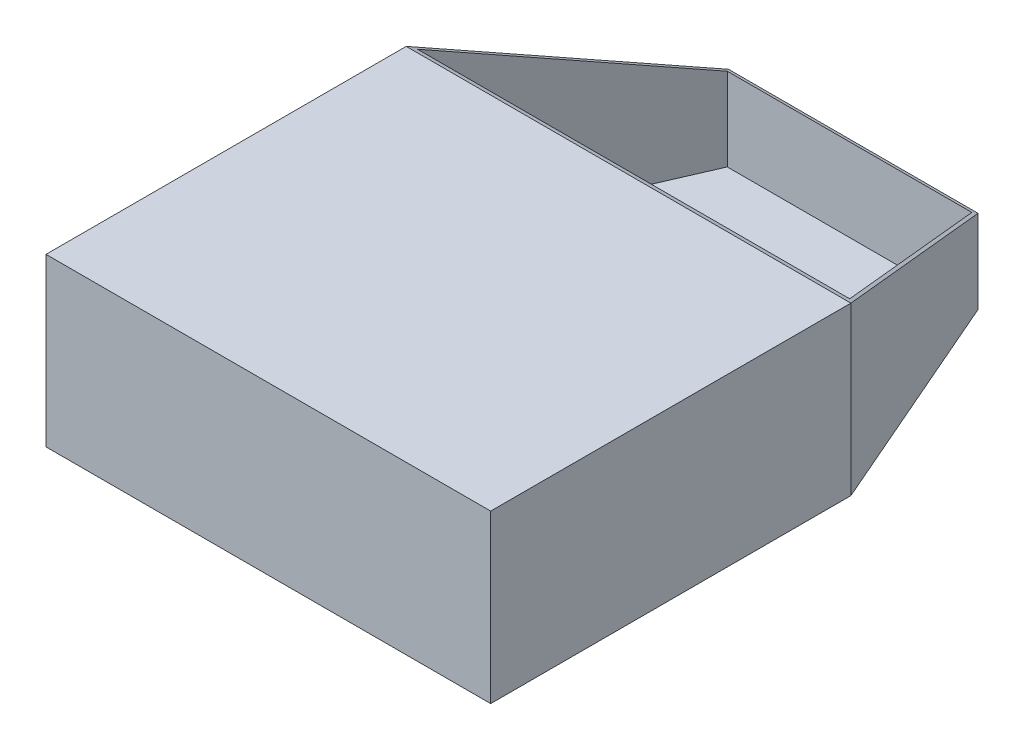
ISO-10303-21;
HEADER;
FILE_DESCRIPTION(('STEP AP214'),'2;1');
FILE_NAME('part.step','',(''),(''),'','','');
FILE_SCHEMA(('AUTOMOTIVE_DESIGN { 1 0 10303 214 1 1 1 1 }'));
ENDSEC;
DATA;
#1=APPLICATION_CONTEXT('core data for automotive mechanical design processes');
#2=APPLICATION_PROTOCOL_DEFINITION('international standard','automotive_design',2000,#1);
#3=PRODUCT_CONTEXT('',#1,'mechanical');
#4=PRODUCT('Part','Part','',(#3));
#5=PRODUCT_RELATED_PRODUCT_CATEGORY('part','',(#4));
#6=PRODUCT_DEFINITION_FORMATION('','',#4);
#7=PRODUCT_DEFINITION_CONTEXT('part definition',#1,'design');
#8=PRODUCT_DEFINITION('design','',#6,#7);
#9=PRODUCT_DEFINITION_SHAPE('','',#8);
#10=(LENGTH_UNIT() NAMED_UNIT(*) SI_UNIT(.MILLI.,.METRE.));
#11=(NAMED_UNIT(*) PLANE_ANGLE_UNIT() SI_UNIT($,.RADIAN.));
#12=(NAMED_UNIT(*) SI_UNIT($,.STERADIAN.) SOLID_ANGLE_UNIT());
#13=UNCERTAINTY_MEASURE_WITH_UNIT(LENGTH_MEASURE(1.E-05),#10,'distance_accuracy_value','');
#14=(GEOMETRIC_REPRESENTATION_CONTEXT(3) GLOBAL_UNCERTAINTY_ASSIGNED_CONTEXT((#13)) GLOBAL_UNIT_ASSIGNED_CONTEXT((#10,
#11,#12)) REPRESENTATION_CONTEXT('',''));
#15=CARTESIAN_POINT('',(0.,0.,0.));
#16=DIRECTION('',(0.,0.,1.));
#17=DIRECTION('',(1.,0.,0.));
#18=AXIS2_PLACEMENT_3D('',#15,#16,#17);
#19=CARTESIAN_POINT('',(0.,89.,0.));
#20=DIRECTION('',(1.,0.,0.));
#21=DIRECTION('',(0.,0.,-1.));
#22=AXIS2_PLACEMENT_3D('',#19,#20,#21);
#23=PLANE('',#22);
#24=DIRECTION('',(0.,0.,1.));
#25=VECTOR('',#24,1.);
#26=CARTESIAN_POINT('',(0.,1.,0.));
#27=LINE('',#26,#25);
#28=CARTESIAN_POINT('',(0.,1.,-192.));
#29=VERTEX_POINT('',#28);
#30=CARTESIAN_POINT('',(0.,1.,0.));
#31=VERTEX_POINT('',#30);
#32=EDGE_CURVE('E257',#29,#31,#27,.T.);
#33=ORIENTED_EDGE('',*,*,#32,.F.);
#34=DIRECTION('',(0.,-1.,0.));
#35=VECTOR('',#34,1.);
#36=CARTESIAN_POINT('',(0.,89.,-192.));
#37=LINE('',#36,#35);
#38=CARTESIAN_POINT('',(0.,89.,-192.));
#39=VERTEX_POINT('',#38);
#40=EDGE_CURVE('E234',#39,#29,#37,.T.);
#41=ORIENTED_EDGE('',*,*,#40,.F.);
#42=DIRECTION('',(0.,0.,1.));
#43=VECTOR('',#42,1.);
#44=CARTESIAN_POINT('',(0.,89.,0.));
#45=LINE('',#44,#43);
#46=CARTESIAN_POINT('',(0.,89.,0.));
#47=VERTEX_POINT('',#46);
#48=EDGE_CURVE('E242',#39,#47,#45,.T.);
#49=ORIENTED_EDGE('',*,*,#48,.T.);
#50=DIRECTION('',(0.,-1.,0.));
#51=VECTOR('',#50,1.);
#52=CARTESIAN_POINT('',(0.,89.,0.));
#53=LINE('',#52,#51);
#54=EDGE_CURVE('E190',#47,#31,#53,.T.);
#55=ORIENTED_EDGE('',*,*,#54,.T.);
#56=EDGE_LOOP('',(#33,#41,#49,#55));
#57=FACE_BOUND('',#56,.T.);
#58=ADVANCED_FACE('F39',(#57),#23,.T.);
#59=CARTESIAN_POINT('',(0.,89.,0.));
#60=DIRECTION('',(0.,0.,-1.));
#61=DIRECTION('',(-1.,0.,0.));
#62=AXIS2_PLACEMENT_3D('',#59,#60,#61);
#63=PLANE('',#62);
#64=DIRECTION('',(1.,0.,0.));
#65=VECTOR('',#64,1.);
#66=CARTESIAN_POINT('',(0.,1.,0.));
#67=LINE('',#66,#65);
#68=CARTESIAN_POINT('',(236.,1.,0.));
#69=VERTEX_POINT('',#68);
#70=EDGE_CURVE('E254',#31,#69,#67,.T.);
#71=ORIENTED_EDGE('',*,*,#70,.F.);
#72=ORIENTED_EDGE('',*,*,#54,.F.);
#73=DIRECTION('',(1.,0.,0.));
#74=VECTOR('',#73,1.);
#75=CARTESIAN_POINT('',(0.,89.,0.));
#76=LINE('',#75,#74);
#77=CARTESIAN_POINT('',(236.,89.,0.));
#78=VERTEX_POINT('',#77);
#79=EDGE_CURVE('E270',#47,#78,#76,.T.);
#80=ORIENTED_EDGE('',*,*,#79,.T.);
#81=DIRECTION('',(0.,-1.,0.));
#82=VECTOR('',#81,1.);
#83=CARTESIAN_POINT('',(236.,89.,0.));
#84=LINE('',#83,#82);
#85=EDGE_CURVE('E197',#78,#69,#84,.T.);
#86=ORIENTED_EDGE('',*,*,#85,.T.);
#87=EDGE_LOOP('',(#71,#72,#80,#86));
#88=FACE_BOUND('',#87,.T.);
#89=ADVANCED_FACE('F315',(#88),#63,.T.);
#90=CARTESIAN_POINT('',(236.,89.,0.));
#91=DIRECTION('',(-1.,0.,0.));
#92=DIRECTION('',(0.,0.,1.));
#93=AXIS2_PLACEMENT_3D('',#90,#91,#92);
#94=PLANE('',#93);
#95=DIRECTION('',(0.,0.,-1.));
#96=VECTOR('',#95,1.);
#97=CARTESIAN_POINT('',(236.,1.,0.));
#98=LINE('',#97,#96);
#99=CARTESIAN_POINT('',(236.,1.,-192.));
#100=VERTEX_POINT('',#99);
#101=EDGE_CURVE('E251',#69,#100,#98,.T.);
#102=ORIENTED_EDGE('',*,*,#101,.F.);
#103=ORIENTED_EDGE('',*,*,#85,.F.);
#104=DIRECTION('',(0.,0.,-1.));
#105=VECTOR('',#104,1.);
#106=CARTESIAN_POINT('',(236.,89.,0.));
#107=LINE('',#106,#105);
#108=CARTESIAN_POINT('',(236.,89.,-192.));
#109=VERTEX_POINT('',#108);
#110=EDGE_CURVE('E267',#78,#109,#107,.T.);
#111=ORIENTED_EDGE('',*,*,#110,.T.);
#112=DIRECTION('',(0.,-1.,0.));
#113=VECTOR('',#112,1.);
#114=CARTESIAN_POINT('',(236.,89.,-192.));
#115=LINE('',#114,#113);
#116=EDGE_CURVE('E224',#109,#100,#115,.T.);
#117=ORIENTED_EDGE('',*,*,#116,.T.);
#118=EDGE_LOOP('',(#102,#103,#111,#117));
#119=FACE_BOUND('',#118,.T.);
#120=ADVANCED_FACE('F318',(#119),#94,.T.);
#121=CARTESIAN_POINT('',(184.,89.,-311.700426223177));
#122=DIRECTION('',(-0.917192351040594,0.,0.398444715352868));
#123=DIRECTION('',(0.398444715352868,0.,0.917192351040594));
#124=AXIS2_PLACEMENT_3D('',#121,#122,#123);
#125=PLANE('',#124);
#126=DIRECTION('',(0.377201670473407,0.322160431912779,0.868292321687715));
#127=VECTOR('',#126,1.);
#128=CARTESIAN_POINT('',(189.256681788977,50.2316824253489,-299.599906018173));
#129=LINE('',#128,#127);
#130=CARTESIAN_POINT('',(184.,45.7420552361596,-311.700426223177));
#131=VERTEX_POINT('',#130);
#132=CARTESIAN_POINT('',(234.648581917051,89.,-195.110871548744));
#133=VERTEX_POINT('',#132);
#134=EDGE_CURVE('E55',#131,#133,#129,.T.);
#135=ORIENTED_EDGE('',*,*,#134,.F.);
#136=DIRECTION('',(0.,-1.,0.));
#137=VECTOR('',#136,1.);
#138=CARTESIAN_POINT('',(184.,89.,-311.700426223177));
#139=LINE('',#138,#137);
#140=CARTESIAN_POINT('',(184.,1.,-311.700426223177));
#141=VERTEX_POINT('',#140);
#142=EDGE_CURVE('E228',#131,#141,#139,.T.);
#143=ORIENTED_EDGE('',*,*,#142,.T.);
#144=DIRECTION('',(-0.398444715352868,0.,-0.917192351040594));
#145=VECTOR('',#144,1.);
#146=CARTESIAN_POINT('',(184.,1.,-311.700426223177));
#147=LINE('',#146,#145);
#148=EDGE_CURVE('E247',#100,#141,#147,.T.);
#149=ORIENTED_EDGE('',*,*,#148,.F.);
#150=ORIENTED_EDGE('',*,*,#116,.F.);
#151=DIRECTION('',(-0.398444715352868,0.,-0.917192351040594));
#152=VECTOR('',#151,1.);
#153=CARTESIAN_POINT('',(184.,89.,-311.700426223177));
#154=LINE('',#153,#152);
#155=EDGE_CURVE('E263',#109,#133,#154,.T.);
#156=ORIENTED_EDGE('',*,*,#155,.T.);
#157=EDGE_LOOP('',(#135,#143,#149,#150,#156));
#158=FACE_BOUND('',#157,.T.);
#159=ADVANCED_FACE('F306',(#158),#125,.T.);
#160=CARTESIAN_POINT('',(52.,89.,-311.700426223177));
#161=DIRECTION('',(0.,0.,1.));
#162=DIRECTION('',(1.,0.,0.));
#163=AXIS2_PLACEMENT_3D('',#160,#161,#162);
#164=PLANE('',#163);
#165=DIRECTION('',(1.,0.,0.));
#166=VECTOR('',#165,1.);
#167=CARTESIAN_POINT('',(52.,45.7420552361596,-311.700426223177));
#168=LINE('',#167,#166);
#169=CARTESIAN_POINT('',(52.,45.7420552361596,-311.700426223177));
#170=VERTEX_POINT('',#169);
#171=EDGE_CURVE('E280',#170,#131,#168,.T.);
#172=ORIENTED_EDGE('',*,*,#171,.F.);
#173=DIRECTION('',(0.,-1.,0.));
#174=VECTOR('',#173,1.);
#175=CARTESIAN_POINT('',(52.,89.,-311.700426223177));
#176=LINE('',#175,#174);
#177=CARTESIAN_POINT('',(52.,1.,-311.700426223177));
#178=VERTEX_POINT('',#177);
#179=EDGE_CURVE('E231',#170,#178,#176,.T.);
#180=ORIENTED_EDGE('',*,*,#179,.T.);
#181=DIRECTION('',(-1.,0.,0.));
#182=VECTOR('',#181,1.);
#183=CARTESIAN_POINT('',(52.,1.,-311.700426223177));
#184=LINE('',#183,#182);
#185=EDGE_CURVE('E243',#141,#178,#184,.T.);
#186=ORIENTED_EDGE('',*,*,#185,.F.);
#187=ORIENTED_EDGE('',*,*,#142,.F.);
#188=EDGE_LOOP('',(#172,#180,#186,#187));
#189=FACE_BOUND('',#188,.T.);
#190=ADVANCED_FACE('F294',(#189),#164,.T.);
#191=CARTESIAN_POINT('',(0.,89.,-192.));
#192=DIRECTION('',(0.917192351040594,0.,0.398444715352869));
#193=DIRECTION('',(0.398444715352869,0.,-0.917192351040594));
#194=AXIS2_PLACEMENT_3D('',#191,#192,#193);
#195=PLANE('',#194);
#196=DIRECTION('',(0.377201670473407,-0.322160431912779,-0.868292321687715));
#197=VECTOR('',#196,1.);
#198=CARTESIAN_POINT('',(0.140260093314504,90.0344259095289,-192.322869095228));
#199=LINE('',#198,#197);
#200=CARTESIAN_POINT('',(1.35141808294902,89.,-195.110871548744));
#201=VERTEX_POINT('',#200);
#202=EDGE_CURVE('E283',#201,#170,#199,.T.);
#203=ORIENTED_EDGE('',*,*,#202,.F.);
#204=DIRECTION('',(-0.398444715352869,0.,0.917192351040594));
#205=VECTOR('',#204,1.);
#206=CARTESIAN_POINT('',(0.,89.,-192.));
#207=LINE('',#206,#205);
#208=EDGE_CURVE('E238',#201,#39,#207,.T.);
#209=ORIENTED_EDGE('',*,*,#208,.T.);
#210=ORIENTED_EDGE('',*,*,#40,.T.);
#211=DIRECTION('',(-0.398444715352869,0.,0.917192351040594));
#212=VECTOR('',#211,1.);
#213=CARTESIAN_POINT('',(0.,1.,-192.));
#214=LINE('',#213,#212);
#215=EDGE_CURVE('E239',#178,#29,#214,.T.);
#216=ORIENTED_EDGE('',*,*,#215,.F.);
#217=ORIENTED_EDGE('',*,*,#179,.F.);
#218=EDGE_LOOP('',(#203,#209,#210,#216,#217));
#219=FACE_BOUND('',#218,.T.);
#220=ADVANCED_FACE('F297',(#219),#195,.T.);
#221=CARTESIAN_POINT('',(0.,89.,0.));
#222=DIRECTION('',(0.,1.,0.));
#223=DIRECTION('',(0.,0.,1.));
#224=AXIS2_PLACEMENT_3D('',#221,#222,#223);
#225=PLANE('',#224);
#226=ORIENTED_EDGE('',*,*,#208,.F.);
#227=DIRECTION('',(1.,0.,0.));
#228=VECTOR('',#227,1.);
#229=CARTESIAN_POINT('',(0.,89.,-195.110871548744));
#230=LINE('',#229,#228);
#231=EDGE_CURVE('E11',#201,#133,#230,.T.);
#232=ORIENTED_EDGE('',*,*,#231,.T.);
#233=ORIENTED_EDGE('',*,*,#155,.F.);
#234=ORIENTED_EDGE('',*,*,#110,.F.);
#235=ORIENTED_EDGE('',*,*,#79,.F.);
#236=ORIENTED_EDGE('',*,*,#48,.F.);
#237=EDGE_LOOP('',(#226,#232,#233,#234,#235,#236));
#238=FACE_BOUND('',#237,.T.);
#239=ADVANCED_FACE('F310',(#238),#225,.F.);
#240=CARTESIAN_POINT('',(0.,1.,0.));
#241=DIRECTION('',(0.,1.,0.));
#242=DIRECTION('',(0.,0.,1.));
#243=AXIS2_PLACEMENT_3D('',#240,#241,#242);
#244=PLANE('',#243);
#245=ORIENTED_EDGE('',*,*,#32,.T.);
#246=ORIENTED_EDGE('',*,*,#70,.T.);
#247=ORIENTED_EDGE('',*,*,#101,.T.);
#248=ORIENTED_EDGE('',*,*,#148,.T.);
#249=ORIENTED_EDGE('',*,*,#185,.T.);
#250=ORIENTED_EDGE('',*,*,#215,.T.);
#251=EDGE_LOOP('',(#245,#246,#247,#248,#249,#250));
#252=FACE_BOUND('',#251,.T.);
#253=ADVANCED_FACE('F301',(#252),#244,.T.);
#254=CARTESIAN_POINT('',(-1.99999999999989,90.,-192.415654397053));
#255=DIRECTION('',(0.,-0.937547911369,0.347856168390939));
#256=DIRECTION('',(0.,-0.347856168390939,-0.937547911369));
#257=AXIS2_PLACEMENT_3D('',#254,#255,#256);
#258=PLANE('',#257);
#259=ORIENTED_EDGE('',*,*,#134,.T.);
#260=ORIENTED_EDGE('',*,*,#231,.F.);
#261=ORIENTED_EDGE('',*,*,#202,.T.);
#262=ORIENTED_EDGE('',*,*,#171,.T.);
#263=EDGE_LOOP('',(#259,#260,#261,#262));
#264=FACE_BOUND('',#263,.T.);
#265=DIRECTION('',(1.,0.,0.));
#266=VECTOR('',#265,1.);
#267=CARTESIAN_POINT('',(-1.99999999999989,90.,-192.415654397053));
#268=LINE('',#267,#266);
#269=CARTESIAN_POINT('',(-2.,90.,-192.415654397053));
#270=VERTEX_POINT('',#269);
#271=CARTESIAN_POINT('',(238.,90.,-192.415654397053));
#272=VERTEX_POINT('',#271);
#273=EDGE_CURVE('E146',#270,#272,#268,.T.);
#274=ORIENTED_EDGE('',*,*,#273,.T.);
#275=DIRECTION('',(-0.377201670473407,-0.322160431912779,-0.868292321687715));
#276=VECTOR('',#275,1.);
#277=CARTESIAN_POINT('',(238.,90.,-192.415654397053));
#278=LINE('',#277,#276);
#279=CARTESIAN_POINT('',(185.311732013388,45.,-313.700426223177));
#280=VERTEX_POINT('',#279);
#281=EDGE_CURVE('E142',#272,#280,#278,.T.);
#282=ORIENTED_EDGE('',*,*,#281,.T.);
#283=DIRECTION('',(1.,0.,0.));
#284=VECTOR('',#283,1.);
#285=CARTESIAN_POINT('',(-54.6882679866122,45.,-313.700426223177));
#286=LINE('',#285,#284);
#287=CARTESIAN_POINT('',(50.6882679866123,45.,-313.700426223177));
#288=VERTEX_POINT('',#287);
#289=EDGE_CURVE('E145',#288,#280,#286,.T.);
#290=ORIENTED_EDGE('',*,*,#289,.F.);
#291=DIRECTION('',(0.377201670473407,-0.322160431912779,-0.868292321687715));
#292=VECTOR('',#291,1.);
#293=CARTESIAN_POINT('',(-64.7356658003288,143.581282302393,-48.0024633260111));
#294=LINE('',#293,#292);
#295=EDGE_CURVE('E63',#270,#288,#294,.T.);
#296=ORIENTED_EDGE('',*,*,#295,.F.);
#297=EDGE_LOOP('',(#274,#282,#290,#296));
#298=FACE_BOUND('',#297,.T.);
#299=ADVANCED_FACE('F144',(#264,#298),#258,.F.);
#300=CARTESIAN_POINT('',(-2.,90.,0.));
#301=DIRECTION('',(1.,0.,0.));
#302=DIRECTION('',(0.,0.,-1.));
#303=AXIS2_PLACEMENT_3D('',#300,#301,#302);
#304=PLANE('',#303);
#305=DIRECTION('',(0.,0.,1.));
#306=VECTOR('',#305,1.);
#307=CARTESIAN_POINT('',(-2.,0.,0.));
#308=LINE('',#307,#306);
#309=CARTESIAN_POINT('',(-2.,0.,-192.415654397053));
#310=VERTEX_POINT('',#309);
#311=CARTESIAN_POINT('',(-2.,0.,2.));
#312=VERTEX_POINT('',#311);
#313=EDGE_CURVE('E187',#310,#312,#308,.T.);
#314=ORIENTED_EDGE('',*,*,#313,.T.);
#315=DIRECTION('',(0.,-1.,0.));
#316=VECTOR('',#315,1.);
#317=CARTESIAN_POINT('',(-2.,90.,2.));
#318=LINE('',#317,#316);
#319=CARTESIAN_POINT('',(-2.,90.,2.));
#320=VERTEX_POINT('',#319);
#321=EDGE_CURVE('E48',#320,#312,#318,.T.);
#322=ORIENTED_EDGE('',*,*,#321,.F.);
#323=DIRECTION('',(0.,0.,1.));
#324=VECTOR('',#323,1.);
#325=CARTESIAN_POINT('',(-2.,90.,0.));
#326=LINE('',#325,#324);
#327=EDGE_CURVE('E211',#270,#320,#326,.T.);
#328=ORIENTED_EDGE('',*,*,#327,.F.);
#329=DIRECTION('',(0.,-1.,0.));
#330=VECTOR('',#329,1.);
#331=CARTESIAN_POINT('',(-2.,90.,-192.415654397053));
#332=LINE('',#331,#330);
#333=EDGE_CURVE('E173',#270,#310,#332,.T.);
#334=ORIENTED_EDGE('',*,*,#333,.T.);
#335=EDGE_LOOP('',(#314,#322,#328,#334));
#336=FACE_BOUND('',#335,.T.);
#337=ADVANCED_FACE('F41',(#336),#304,.F.);
#338=CARTESIAN_POINT('',(0.,90.,2.));
#339=DIRECTION('',(0.,0.,-1.));
#340=DIRECTION('',(-1.,0.,0.));
#341=AXIS2_PLACEMENT_3D('',#338,#339,#340);
#342=PLANE('',#341);
#343=DIRECTION('',(1.,0.,0.));
#344=VECTOR('',#343,1.);
#345=CARTESIAN_POINT('',(0.,0.,2.));
#346=LINE('',#345,#344);
#347=CARTESIAN_POINT('',(238.,0.,2.));
#348=VERTEX_POINT('',#347);
#349=EDGE_CURVE('E183',#312,#348,#346,.T.);
#350=ORIENTED_EDGE('',*,*,#349,.T.);
#351=DIRECTION('',(0.,-1.,0.));
#352=VECTOR('',#351,1.);
#353=CARTESIAN_POINT('',(238.,90.,2.));
#354=LINE('',#353,#352);
#355=CARTESIAN_POINT('',(238.,90.,2.));
#356=VERTEX_POINT('',#355);
#357=EDGE_CURVE('E171',#356,#348,#354,.T.);
#358=ORIENTED_EDGE('',*,*,#357,.F.);
#359=DIRECTION('',(1.,0.,0.));
#360=VECTOR('',#359,1.);
#361=CARTESIAN_POINT('',(0.,90.,2.));
#362=LINE('',#361,#360);
#363=EDGE_CURVE('E96',#320,#356,#362,.T.);
#364=ORIENTED_EDGE('',*,*,#363,.F.);
#365=ORIENTED_EDGE('',*,*,#321,.T.);
#366=EDGE_LOOP('',(#350,#358,#364,#365));
#367=FACE_BOUND('',#366,.T.);
#368=ADVANCED_FACE('F182',(#367),#342,.F.);
#369=CARTESIAN_POINT('',(238.,90.,0.));
#370=DIRECTION('',(-1.,0.,0.));
#371=DIRECTION('',(0.,0.,1.));
#372=AXIS2_PLACEMENT_3D('',#369,#370,#371);
#373=PLANE('',#372);
#374=DIRECTION('',(0.,0.,-1.));
#375=VECTOR('',#374,1.);
#376=CARTESIAN_POINT('',(238.,0.,0.));
#377=LINE('',#376,#375);
#378=CARTESIAN_POINT('',(238.,0.,-192.415654397053));
#379=VERTEX_POINT('',#378);
#380=EDGE_CURVE('E194',#348,#379,#377,.T.);
#381=ORIENTED_EDGE('',*,*,#380,.T.);
#382=DIRECTION('',(0.,-1.,0.));
#383=VECTOR('',#382,1.);
#384=CARTESIAN_POINT('',(238.,90.,-192.415654397053));
#385=LINE('',#384,#383);
#386=EDGE_CURVE('E167',#272,#379,#385,.T.);
#387=ORIENTED_EDGE('',*,*,#386,.F.);
#388=DIRECTION('',(0.,0.,-1.));
#389=VECTOR('',#388,1.);
#390=CARTESIAN_POINT('',(238.,90.,0.));
#391=LINE('',#390,#389);
#392=EDGE_CURVE('E200',#356,#272,#391,.T.);
#393=ORIENTED_EDGE('',*,*,#392,.F.);
#394=ORIENTED_EDGE('',*,*,#357,.T.);
#395=EDGE_LOOP('',(#381,#387,#393,#394));
#396=FACE_BOUND('',#395,.T.);
#397=ADVANCED_FACE('F345',(#396),#373,.F.);
#398=CARTESIAN_POINT('',(270.533937065587,90.,-117.524767214961));
#399=DIRECTION('',(-0.917192351040594,0.,0.398444715352868));
#400=DIRECTION('',(0.398444715352869,0.,0.917192351040594));
#401=AXIS2_PLACEMENT_3D('',#398,#399,#400);
#402=PLANE('',#401);
#403=DIRECTION('',(0.,-1.,0.));
#404=VECTOR('',#403,1.);
#405=CARTESIAN_POINT('',(185.311732013388,90.,-313.700426223177));
#406=LINE('',#405,#404);
#407=CARTESIAN_POINT('',(185.311732013388,0.,-313.700426223177));
#408=VERTEX_POINT('',#407);
#409=EDGE_CURVE('E157',#280,#408,#406,.T.);
#410=ORIENTED_EDGE('',*,*,#409,.F.);
#411=ORIENTED_EDGE('',*,*,#281,.F.);
#412=ORIENTED_EDGE('',*,*,#386,.T.);
#413=DIRECTION('',(-0.398444715352869,0.,-0.917192351040594));
#414=VECTOR('',#413,1.);
#415=CARTESIAN_POINT('',(270.533937065587,0.,-117.524767214961));
#416=LINE('',#415,#414);
#417=EDGE_CURVE('E164',#379,#408,#416,.T.);
#418=ORIENTED_EDGE('',*,*,#417,.T.);
#419=EDGE_LOOP('',(#410,#411,#412,#418));
#420=FACE_BOUND('',#419,.T.);
#421=ADVANCED_FACE('F162',(#420),#402,.F.);
#422=CARTESIAN_POINT('',(0.,90.,-313.700426223177));
#423=DIRECTION('',(0.,0.,1.));
#424=DIRECTION('',(1.,0.,0.));
#425=AXIS2_PLACEMENT_3D('',#422,#423,#424);
#426=PLANE('',#425);
#427=DIRECTION('',(0.,-1.,0.));
#428=VECTOR('',#427,1.);
#429=CARTESIAN_POINT('',(50.6882679866123,90.,-313.700426223177));
#430=LINE('',#429,#428);
#431=CARTESIAN_POINT('',(50.6882679866123,0.,-313.700426223177));
#432=VERTEX_POINT('',#431);
#433=EDGE_CURVE('E159',#288,#432,#430,.T.);
#434=ORIENTED_EDGE('',*,*,#433,.F.);
#435=ORIENTED_EDGE('',*,*,#289,.T.);
#436=ORIENTED_EDGE('',*,*,#409,.T.);
#437=DIRECTION('',(-1.,0.,0.));
#438=VECTOR('',#437,1.);
#439=CARTESIAN_POINT('',(0.,0.,-313.700426223177));
#440=LINE('',#439,#438);
#441=EDGE_CURVE('E207',#408,#432,#440,.T.);
#442=ORIENTED_EDGE('',*,*,#441,.T.);
#443=EDGE_LOOP('',(#434,#435,#436,#442));
#444=FACE_BOUND('',#443,.T.);
#445=ADVANCED_FACE('F155',(#444),#426,.F.);
#446=CARTESIAN_POINT('',(-72.0008701870471,90.,-31.2784621396904));
#447=DIRECTION('',(0.917192351040594,0.,0.398444715352868));
#448=DIRECTION('',(0.398444715352869,0.,-0.917192351040594));
#449=AXIS2_PLACEMENT_3D('',#446,#447,#448);
#450=PLANE('',#449);
#451=ORIENTED_EDGE('',*,*,#333,.F.);
#452=ORIENTED_EDGE('',*,*,#295,.T.);
#453=ORIENTED_EDGE('',*,*,#433,.T.);
#454=DIRECTION('',(-0.398444715352869,0.,0.917192351040594));
#455=VECTOR('',#454,1.);
#456=CARTESIAN_POINT('',(-72.0008701870471,0.,-31.2784621396904));
#457=LINE('',#456,#455);
#458=EDGE_CURVE('E90',#432,#310,#457,.T.);
#459=ORIENTED_EDGE('',*,*,#458,.T.);
#460=EDGE_LOOP('',(#451,#452,#453,#459));
#461=FACE_BOUND('',#460,.T.);
#462=ADVANCED_FACE('F336',(#461),#450,.F.);
#463=CARTESIAN_POINT('',(0.,90.,0.));
#464=DIRECTION('',(0.,1.,0.));
#465=DIRECTION('',(0.,0.,1.));
#466=AXIS2_PLACEMENT_3D('',#463,#464,#465);
#467=PLANE('',#466);
#468=ORIENTED_EDGE('',*,*,#273,.F.);
#469=ORIENTED_EDGE('',*,*,#327,.T.);
#470=ORIENTED_EDGE('',*,*,#363,.T.);
#471=ORIENTED_EDGE('',*,*,#392,.T.);
#472=EDGE_LOOP('',(#468,#469,#470,#471));
#473=FACE_BOUND('',#472,.T.);
#474=ADVANCED_FACE('F332',(#473),#467,.T.);
#475=CARTESIAN_POINT('',(0.,0.,0.));
#476=DIRECTION('',(0.,1.,0.));
#477=DIRECTION('',(0.,0.,1.));
#478=AXIS2_PLACEMENT_3D('',#475,#476,#477);
#479=PLANE('',#478);
#480=ORIENTED_EDGE('',*,*,#313,.F.);
#481=ORIENTED_EDGE('',*,*,#458,.F.);
#482=ORIENTED_EDGE('',*,*,#441,.F.);
#483=ORIENTED_EDGE('',*,*,#417,.F.);
#484=ORIENTED_EDGE('',*,*,#380,.F.);
#485=ORIENTED_EDGE('',*,*,#349,.F.);
#486=EDGE_LOOP('',(#480,#481,#482,#483,#484,#485));
#487=FACE_BOUND('',#486,.T.);
#488=ADVANCED_FACE('F335',(#487),#479,.F.);
#489=CLOSED_SHELL('',(#58,#89,#120,#159,#190,#220,#239,#253,#299,#337,#368,#397,#421,#445,#462,
#474,#488));
#490=MANIFOLD_SOLID_BREP('B2',#489);
#491=ADVANCED_BREP_SHAPE_REPRESENTATION('',(#18,#490),#14);
#492=SHAPE_DEFINITION_REPRESENTATION(#9,#491);
ENDSEC;
END-ISO-10303-21;
